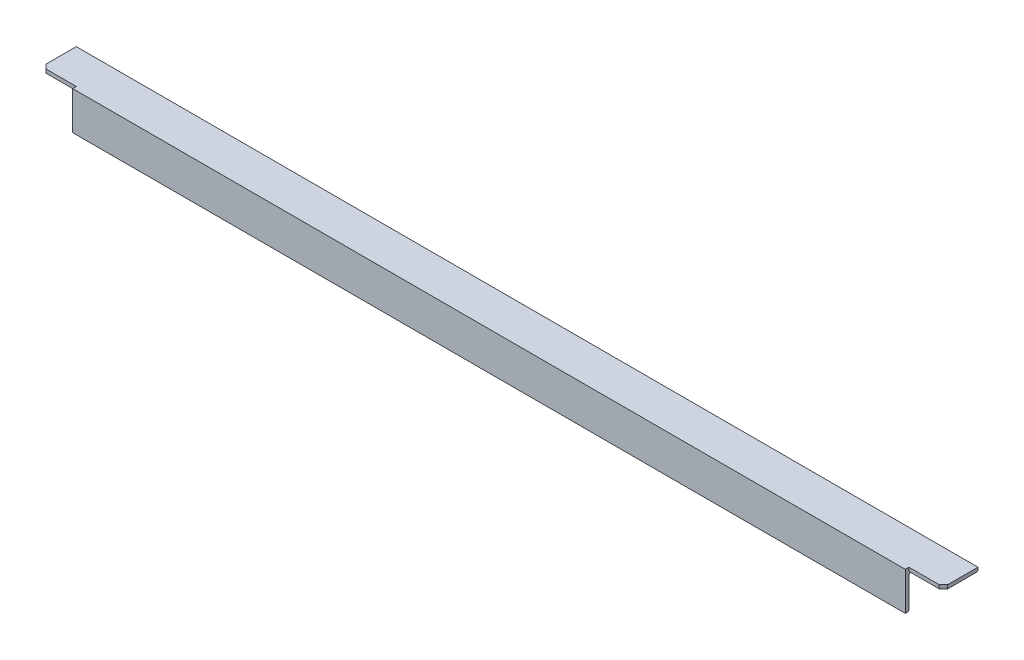
ISO-10303-21;
HEADER;
FILE_DESCRIPTION(('STEP AP214'),'2;1');
FILE_NAME('part.step','',(''),(''),'','','');
FILE_SCHEMA(('AUTOMOTIVE_DESIGN { 1 0 10303 214 1 1 1 1 }'));
ENDSEC;
DATA;
#1=APPLICATION_CONTEXT('core data for automotive mechanical design processes');
#2=APPLICATION_PROTOCOL_DEFINITION('international standard','automotive_design',2000,#1);
#3=PRODUCT_CONTEXT('',#1,'mechanical');
#4=PRODUCT('Part','Part','',(#3));
#5=PRODUCT_RELATED_PRODUCT_CATEGORY('part','',(#4));
#6=PRODUCT_DEFINITION_FORMATION('','',#4);
#7=PRODUCT_DEFINITION_CONTEXT('part definition',#1,'design');
#8=PRODUCT_DEFINITION('design','',#6,#7);
#9=PRODUCT_DEFINITION_SHAPE('','',#8);
#10=(LENGTH_UNIT() NAMED_UNIT(*) SI_UNIT(.MILLI.,.METRE.));
#11=(NAMED_UNIT(*) PLANE_ANGLE_UNIT() SI_UNIT($,.RADIAN.));
#12=(NAMED_UNIT(*) SI_UNIT($,.STERADIAN.) SOLID_ANGLE_UNIT());
#13=UNCERTAINTY_MEASURE_WITH_UNIT(LENGTH_MEASURE(1.E-05),#10,'distance_accuracy_value','');
#14=(GEOMETRIC_REPRESENTATION_CONTEXT(3) GLOBAL_UNCERTAINTY_ASSIGNED_CONTEXT((#13)) GLOBAL_UNIT_ASSIGNED_CONTEXT((#10,
#11,#12)) REPRESENTATION_CONTEXT('',''));
#15=CARTESIAN_POINT('',(0.,0.,0.));
#16=DIRECTION('',(0.,0.,1.));
#17=DIRECTION('',(1.,0.,0.));
#18=AXIS2_PLACEMENT_3D('',#15,#16,#17);
#19=CARTESIAN_POINT('',(750.,587.,487.));
#20=DIRECTION('',(-1.,0.,0.));
#21=DIRECTION('',(0.,0.,1.));
#22=AXIS2_PLACEMENT_3D('',#19,#20,#21);
#23=CYLINDRICAL_SURFACE('',#22,7.00000000000001);
#24=CARTESIAN_POINT('',(-687.,587.,487.));
#25=DIRECTION('',(-1.,0.,0.));
#26=DIRECTION('',(0.,0.,1.));
#27=AXIS2_PLACEMENT_3D('',#24,#25,#26);
#28=CIRCLE('',#27,7.00000000000001);
#29=CARTESIAN_POINT('',(-687.,594.000000000001,486.999999999988));
#30=VERTEX_POINT('',#29);
#31=CARTESIAN_POINT('',(-687.,587.,494.));
#32=VERTEX_POINT('',#31);
#33=EDGE_CURVE('E237',#30,#32,#28,.F.);
#34=ORIENTED_EDGE('',*,*,#33,.F.);
#35=DIRECTION('',(-1.,0.,0.));
#36=VECTOR('',#35,1.);
#37=CARTESIAN_POINT('',(750.,594.,487.));
#38=LINE('',#37,#36);
#39=CARTESIAN_POINT('',(687.,594.000000000001,486.999999999999));
#40=VERTEX_POINT('',#39);
#41=EDGE_CURVE('E122',#40,#30,#38,.T.);
#42=ORIENTED_EDGE('',*,*,#41,.F.);
#43=CARTESIAN_POINT('',(687.,587.,487.));
#44=DIRECTION('',(1.,0.,0.));
#45=DIRECTION('',(0.,0.,-1.));
#46=AXIS2_PLACEMENT_3D('',#43,#44,#45);
#47=CIRCLE('',#46,7.00000000000001);
#48=CARTESIAN_POINT('',(687.,587.,493.999999999999));
#49=VERTEX_POINT('',#48);
#50=EDGE_CURVE('E138',#49,#40,#47,.F.);
#51=ORIENTED_EDGE('',*,*,#50,.F.);
#52=DIRECTION('',(-1.,0.,0.));
#53=VECTOR('',#52,1.);
#54=CARTESIAN_POINT('',(750.,587.,494.));
#55=LINE('',#54,#53);
#56=EDGE_CURVE('E195',#49,#32,#55,.T.);
#57=ORIENTED_EDGE('',*,*,#56,.T.);
#58=EDGE_LOOP('',(#34,#42,#51,#57));
#59=FACE_BOUND('',#58,.T.);
#60=ADVANCED_FACE('F34',(#59),#23,.F.);
#61=CARTESIAN_POINT('',(750.,600.000000000001,437.));
#62=DIRECTION('',(0.,0.,1.));
#63=DIRECTION('',(0.,-1.,0.));
#64=AXIS2_PLACEMENT_3D('',#61,#62,#63);
#65=PLANE('',#64);
#66=DIRECTION('',(0.,-1.,0.));
#67=VECTOR('',#66,1.);
#68=CARTESIAN_POINT('',(-744.000000000001,1100.,437.));
#69=LINE('',#68,#67);
#70=CARTESIAN_POINT('',(-744.000000000001,600.000000000001,437.));
#71=VERTEX_POINT('',#70);
#72=CARTESIAN_POINT('',(-744.000000000001,596.300000000001,437.));
#73=VERTEX_POINT('',#72);
#74=EDGE_CURVE('E205',#71,#73,#69,.T.);
#75=ORIENTED_EDGE('',*,*,#74,.F.);
#76=DIRECTION('',(-1.,0.,0.));
#77=VECTOR('',#76,1.);
#78=CARTESIAN_POINT('',(750.,600.000000000001,437.));
#79=LINE('',#78,#77);
#80=CARTESIAN_POINT('',(744.,600.000000000001,437.));
#81=VERTEX_POINT('',#80);
#82=EDGE_CURVE('E131',#81,#71,#79,.T.);
#83=ORIENTED_EDGE('',*,*,#82,.F.);
#84=DIRECTION('',(0.,1.,0.));
#85=VECTOR('',#84,1.);
#86=CARTESIAN_POINT('',(744.,0.,437.));
#87=LINE('',#86,#85);
#88=CARTESIAN_POINT('',(744.,596.300000000001,437.));
#89=VERTEX_POINT('',#88);
#90=EDGE_CURVE('E179',#89,#81,#87,.T.);
#91=ORIENTED_EDGE('',*,*,#90,.F.);
#92=DIRECTION('',(-1.,0.,0.));
#93=VECTOR('',#92,1.);
#94=CARTESIAN_POINT('',(750.,596.300000000001,437.));
#95=LINE('',#94,#93);
#96=EDGE_CURVE('E135',#89,#73,#95,.T.);
#97=ORIENTED_EDGE('',*,*,#96,.T.);
#98=EDGE_LOOP('',(#75,#83,#91,#97));
#99=FACE_BOUND('',#98,.T.);
#100=ADVANCED_FACE('F36',(#99),#65,.F.);
#101=CARTESIAN_POINT('',(750.,600.000000000001,437.));
#102=DIRECTION('',(0.,-1.,0.));
#103=DIRECTION('',(0.,0.,-1.));
#104=AXIS2_PLACEMENT_3D('',#101,#102,#103);
#105=PLANE('',#104);
#106=DIRECTION('',(0.,0.,-1.));
#107=VECTOR('',#106,1.);
#108=CARTESIAN_POINT('',(-744.000000000001,600.000000000001,437.000000000013));
#109=LINE('',#108,#107);
#110=CARTESIAN_POINT('',(-744.,600.000000000001,487.));
#111=VERTEX_POINT('',#110);
#112=EDGE_CURVE('E203',#111,#71,#109,.T.);
#113=ORIENTED_EDGE('',*,*,#112,.F.);
#114=DIRECTION('',(0.707106781186548,0.,0.707106781186547));
#115=VECTOR('',#114,1.);
#116=CARTESIAN_POINT('',(-21.999999999999,599.999999999992,1209.));
#117=LINE('',#116,#115);
#118=CARTESIAN_POINT('',(-737.,600.,494.));
#119=VERTEX_POINT('',#118);
#120=EDGE_CURVE('E137',#111,#119,#117,.T.);
#121=ORIENTED_EDGE('',*,*,#120,.T.);
#122=DIRECTION('',(-1.,0.,0.));
#123=VECTOR('',#122,1.);
#124=CARTESIAN_POINT('',(750.,600.,493.999999999989));
#125=LINE('',#124,#123);
#126=CARTESIAN_POINT('',(-687.,600.,494.));
#127=VERTEX_POINT('',#126);
#128=EDGE_CURVE('E197',#127,#119,#125,.T.);
#129=ORIENTED_EDGE('',*,*,#128,.F.);
#130=DIRECTION('',(0.,0.,-1.));
#131=VECTOR('',#130,1.);
#132=CARTESIAN_POINT('',(-687.,600.000000000001,436.999999999995));
#133=LINE('',#132,#131);
#134=CARTESIAN_POINT('',(-687.,600.,500.));
#135=VERTEX_POINT('',#134);
#136=EDGE_CURVE('E74',#135,#127,#133,.T.);
#137=ORIENTED_EDGE('',*,*,#136,.F.);
#138=DIRECTION('',(-1.,0.,0.));
#139=VECTOR('',#138,1.);
#140=CARTESIAN_POINT('',(750.,600.,500.));
#141=LINE('',#140,#139);
#142=CARTESIAN_POINT('',(687.,600.,500.));
#143=VERTEX_POINT('',#142);
#144=EDGE_CURVE('E124',#143,#135,#141,.T.);
#145=ORIENTED_EDGE('',*,*,#144,.F.);
#146=DIRECTION('',(0.,0.,1.));
#147=VECTOR('',#146,1.);
#148=CARTESIAN_POINT('',(687.,600.000000000001,437.));
#149=LINE('',#148,#147);
#150=CARTESIAN_POINT('',(687.,600.,494.));
#151=VERTEX_POINT('',#150);
#152=EDGE_CURVE('E171',#151,#143,#149,.T.);
#153=ORIENTED_EDGE('',*,*,#152,.F.);
#154=DIRECTION('',(-1.,0.,0.));
#155=VECTOR('',#154,1.);
#156=CARTESIAN_POINT('',(749.999999999999,600.,494.));
#157=LINE('',#156,#155);
#158=CARTESIAN_POINT('',(737.,600.,494.));
#159=VERTEX_POINT('',#158);
#160=EDGE_CURVE('E193',#159,#151,#157,.T.);
#161=ORIENTED_EDGE('',*,*,#160,.F.);
#162=DIRECTION('',(0.707106781186548,0.,-0.707106781186547));
#163=VECTOR('',#162,1.);
#164=CARTESIAN_POINT('',(772.,600.000000000001,459.));
#165=LINE('',#164,#163);
#166=CARTESIAN_POINT('',(744.,600.000000000001,487.));
#167=VERTEX_POINT('',#166);
#168=EDGE_CURVE('E134',#159,#167,#165,.T.);
#169=ORIENTED_EDGE('',*,*,#168,.T.);
#170=DIRECTION('',(0.,0.,1.));
#171=VECTOR('',#170,1.);
#172=CARTESIAN_POINT('',(744.,600.000000000001,437.));
#173=LINE('',#172,#171);
#174=EDGE_CURVE('E170',#81,#167,#173,.T.);
#175=ORIENTED_EDGE('',*,*,#174,.F.);
#176=ORIENTED_EDGE('',*,*,#82,.T.);
#177=EDGE_LOOP('',(#113,#121,#129,#137,#145,#153,#161,#169,#175,#176));
#178=FACE_BOUND('',#177,.T.);
#179=ADVANCED_FACE('F267',(#178),#105,.F.);
#180=CARTESIAN_POINT('',(750.,600.,500.));
#181=DIRECTION('',(0.,0.,-1.));
#182=DIRECTION('',(0.,1.,0.));
#183=AXIS2_PLACEMENT_3D('',#180,#181,#182);
#184=PLANE('',#183);
#185=DIRECTION('',(0.,-1.,0.));
#186=VECTOR('',#185,1.);
#187=CARTESIAN_POINT('',(-687.,1100.,500.));
#188=LINE('',#187,#186);
#189=CARTESIAN_POINT('',(-687.,537.,500.));
#190=VERTEX_POINT('',#189);
#191=EDGE_CURVE('E58',#135,#190,#188,.T.);
#192=ORIENTED_EDGE('',*,*,#191,.T.);
#193=DIRECTION('',(-1.,0.,0.));
#194=VECTOR('',#193,1.);
#195=CARTESIAN_POINT('',(750.,537.,499.999999999999));
#196=LINE('',#195,#194);
#197=CARTESIAN_POINT('',(687.,537.,499.999999999999));
#198=VERTEX_POINT('',#197);
#199=EDGE_CURVE('E114',#198,#190,#196,.T.);
#200=ORIENTED_EDGE('',*,*,#199,.F.);
#201=DIRECTION('',(0.,1.,0.));
#202=VECTOR('',#201,1.);
#203=CARTESIAN_POINT('',(687.,0.,499.999999999999));
#204=LINE('',#203,#202);
#205=EDGE_CURVE('E130',#198,#143,#204,.T.);
#206=ORIENTED_EDGE('',*,*,#205,.T.);
#207=ORIENTED_EDGE('',*,*,#144,.T.);
#208=EDGE_LOOP('',(#192,#200,#206,#207));
#209=FACE_BOUND('',#208,.T.);
#210=ADVANCED_FACE('F272',(#209),#184,.F.);
#211=CARTESIAN_POINT('',(750.,537.,496.299999999999));
#212=DIRECTION('',(0.,1.,0.));
#213=DIRECTION('',(0.,0.,1.));
#214=AXIS2_PLACEMENT_3D('',#211,#212,#213);
#215=PLANE('',#214);
#216=DIRECTION('',(0.,0.,1.));
#217=VECTOR('',#216,1.);
#218=CARTESIAN_POINT('',(-687.,537.,496.299999999995));
#219=LINE('',#218,#217);
#220=CARTESIAN_POINT('',(-687.,537.,496.299999999999));
#221=VERTEX_POINT('',#220);
#222=EDGE_CURVE('E98',#221,#190,#219,.T.);
#223=ORIENTED_EDGE('',*,*,#222,.F.);
#224=DIRECTION('',(-1.,0.,0.));
#225=VECTOR('',#224,1.);
#226=CARTESIAN_POINT('',(750.,537.,496.299999999999));
#227=LINE('',#226,#225);
#228=CARTESIAN_POINT('',(687.,537.,496.299999999999));
#229=VERTEX_POINT('',#228);
#230=EDGE_CURVE('E112',#229,#221,#227,.T.);
#231=ORIENTED_EDGE('',*,*,#230,.F.);
#232=DIRECTION('',(0.,0.,-1.));
#233=VECTOR('',#232,1.);
#234=CARTESIAN_POINT('',(687.,537.,496.3));
#235=LINE('',#234,#233);
#236=EDGE_CURVE('E187',#198,#229,#235,.T.);
#237=ORIENTED_EDGE('',*,*,#236,.F.);
#238=ORIENTED_EDGE('',*,*,#199,.T.);
#239=EDGE_LOOP('',(#223,#231,#237,#238));
#240=FACE_BOUND('',#239,.T.);
#241=ADVANCED_FACE('F109',(#240),#215,.F.);
#242=CARTESIAN_POINT('',(750.,539.3,496.299999999999));
#243=DIRECTION('',(-1.,0.,0.));
#244=DIRECTION('',(0.,0.,1.));
#245=AXIS2_PLACEMENT_3D('',#242,#243,#244);
#246=CYLINDRICAL_SURFACE('',#245,2.29999999999997);
#247=CARTESIAN_POINT('',(-687.,539.3,496.299999999999));
#248=DIRECTION('',(-1.,0.,0.));
#249=DIRECTION('',(0.,0.,1.));
#250=AXIS2_PLACEMENT_3D('',#247,#248,#249);
#251=CIRCLE('',#250,2.29999999999997);
#252=CARTESIAN_POINT('',(-687.,539.3,494.));
#253=VERTEX_POINT('',#252);
#254=EDGE_CURVE('E95',#253,#221,#251,.T.);
#255=ORIENTED_EDGE('',*,*,#254,.F.);
#256=DIRECTION('',(-1.,0.,0.));
#257=VECTOR('',#256,1.);
#258=CARTESIAN_POINT('',(750.,539.3,493.999999999999));
#259=LINE('',#258,#257);
#260=CARTESIAN_POINT('',(687.,539.3,494.));
#261=VERTEX_POINT('',#260);
#262=EDGE_CURVE('E120',#261,#253,#259,.T.);
#263=ORIENTED_EDGE('',*,*,#262,.F.);
#264=CARTESIAN_POINT('',(687.,539.3,496.299999999999));
#265=DIRECTION('',(1.,0.,0.));
#266=DIRECTION('',(0.,0.,-1.));
#267=AXIS2_PLACEMENT_3D('',#264,#265,#266);
#268=CIRCLE('',#267,2.29999999999997);
#269=EDGE_CURVE('E119',#229,#261,#268,.T.);
#270=ORIENTED_EDGE('',*,*,#269,.F.);
#271=ORIENTED_EDGE('',*,*,#230,.T.);
#272=EDGE_LOOP('',(#255,#263,#270,#271));
#273=FACE_BOUND('',#272,.T.);
#274=ADVANCED_FACE('F117',(#273),#246,.T.);
#275=CARTESIAN_POINT('',(750.,587.,494.));
#276=DIRECTION('',(0.,0.,1.));
#277=DIRECTION('',(0.,-1.,0.));
#278=AXIS2_PLACEMENT_3D('',#275,#276,#277);
#279=PLANE('',#278);
#280=DIRECTION('',(0.,-1.,0.));
#281=VECTOR('',#280,1.);
#282=CARTESIAN_POINT('',(-687.,1100.,494.));
#283=LINE('',#282,#281);
#284=EDGE_CURVE('E100',#32,#253,#283,.T.);
#285=ORIENTED_EDGE('',*,*,#284,.F.);
#286=ORIENTED_EDGE('',*,*,#56,.F.);
#287=DIRECTION('',(0.,1.,0.));
#288=VECTOR('',#287,1.);
#289=CARTESIAN_POINT('',(687.,0.,494.));
#290=LINE('',#289,#288);
#291=EDGE_CURVE('E186',#261,#49,#290,.T.);
#292=ORIENTED_EDGE('',*,*,#291,.F.);
#293=ORIENTED_EDGE('',*,*,#262,.T.);
#294=EDGE_LOOP('',(#285,#286,#292,#293));
#295=FACE_BOUND('',#294,.T.);
#296=ADVANCED_FACE('F293',(#295),#279,.F.);
#297=CARTESIAN_POINT('',(750.,594.000000000001,439.3));
#298=DIRECTION('',(0.,1.,0.));
#299=DIRECTION('',(0.,0.,1.));
#300=AXIS2_PLACEMENT_3D('',#297,#298,#299);
#301=PLANE('',#300);
#302=DIRECTION('',(0.,0.,1.));
#303=VECTOR('',#302,1.);
#304=CARTESIAN_POINT('',(-744.000000000001,594.000000000001,439.300000000013));
#305=LINE('',#304,#303);
#306=CARTESIAN_POINT('',(-744.000000000001,594.000000000001,439.3));
#307=VERTEX_POINT('',#306);
#308=CARTESIAN_POINT('',(-744.,594.000000000001,486.999999999988));
#309=VERTEX_POINT('',#308);
#310=EDGE_CURVE('E207',#307,#309,#305,.T.);
#311=ORIENTED_EDGE('',*,*,#310,.F.);
#312=DIRECTION('',(-1.,0.,0.));
#313=VECTOR('',#312,1.);
#314=CARTESIAN_POINT('',(750.,594.000000000001,439.3));
#315=LINE('',#314,#313);
#316=CARTESIAN_POINT('',(744.,594.000000000001,439.3));
#317=VERTEX_POINT('',#316);
#318=EDGE_CURVE('E176',#317,#307,#315,.T.);
#319=ORIENTED_EDGE('',*,*,#318,.F.);
#320=DIRECTION('',(0.,0.,-1.));
#321=VECTOR('',#320,1.);
#322=CARTESIAN_POINT('',(744.,594.000000000001,439.3));
#323=LINE('',#322,#321);
#324=CARTESIAN_POINT('',(744.,594.000000000001,487.));
#325=VERTEX_POINT('',#324);
#326=EDGE_CURVE('E166',#325,#317,#323,.T.);
#327=ORIENTED_EDGE('',*,*,#326,.F.);
#328=DIRECTION('',(0.707106781186548,0.,-0.707106781186547));
#329=VECTOR('',#328,1.);
#330=CARTESIAN_POINT('',(744.,594.000000000001,487.));
#331=LINE('',#330,#329);
#332=CARTESIAN_POINT('',(737.,594.000000000001,494.));
#333=VERTEX_POINT('',#332);
#334=EDGE_CURVE('E42',#333,#325,#331,.T.);
#335=ORIENTED_EDGE('',*,*,#334,.F.);
#336=DIRECTION('',(1.,0.,0.));
#337=VECTOR('',#336,1.);
#338=CARTESIAN_POINT('',(677.100505063388,594.000000000001,493.999999999999));
#339=LINE('',#338,#337);
#340=CARTESIAN_POINT('',(687.,594.000000000001,494.));
#341=VERTEX_POINT('',#340);
#342=EDGE_CURVE('E264',#341,#333,#339,.T.);
#343=ORIENTED_EDGE('',*,*,#342,.F.);
#344=DIRECTION('',(0.,0.,-1.));
#345=VECTOR('',#344,1.);
#346=CARTESIAN_POINT('',(687.,594.000000000001,486.999999999999));
#347=LINE('',#346,#345);
#348=EDGE_CURVE('E49',#341,#40,#347,.T.);
#349=ORIENTED_EDGE('',*,*,#348,.T.);
#350=ORIENTED_EDGE('',*,*,#41,.T.);
#351=DIRECTION('',(0.,0.,1.));
#352=VECTOR('',#351,1.);
#353=CARTESIAN_POINT('',(-687.,594.000000000001,439.300000000001));
#354=LINE('',#353,#352);
#355=CARTESIAN_POINT('',(-687.,594.000000000001,493.999999999988));
#356=VERTEX_POINT('',#355);
#357=EDGE_CURVE('E228',#30,#356,#354,.T.);
#358=ORIENTED_EDGE('',*,*,#357,.T.);
#359=DIRECTION('',(-1.,0.,0.));
#360=VECTOR('',#359,1.);
#361=CARTESIAN_POINT('',(-677.100505063388,594.000000000001,493.999999999988));
#362=LINE('',#361,#360);
#363=CARTESIAN_POINT('',(-737.000000000013,594.000000000001,493.999999999987));
#364=VERTEX_POINT('',#363);
#365=EDGE_CURVE('E425',#356,#364,#362,.T.);
#366=ORIENTED_EDGE('',*,*,#365,.T.);
#367=DIRECTION('',(0.707106781186548,0.,0.707106781186547));
#368=VECTOR('',#367,1.);
#369=CARTESIAN_POINT('',(-744.,594.000000000001,487.));
#370=LINE('',#369,#368);
#371=EDGE_CURVE('E11',#309,#364,#370,.T.);
#372=ORIENTED_EDGE('',*,*,#371,.F.);
#373=EDGE_LOOP('',(#311,#319,#327,#335,#343,#349,#350,#358,#366,#372));
#374=FACE_BOUND('',#373,.T.);
#375=ADVANCED_FACE('F174',(#374),#301,.F.);
#376=CARTESIAN_POINT('',(750.,596.300000000001,439.3));
#377=DIRECTION('',(-1.,0.,0.));
#378=DIRECTION('',(0.,0.,1.));
#379=AXIS2_PLACEMENT_3D('',#376,#377,#378);
#380=CYLINDRICAL_SURFACE('',#379,2.3);
#381=CARTESIAN_POINT('',(-744.000000000001,596.300000000001,439.3));
#382=DIRECTION('',(-1.,0.,0.));
#383=DIRECTION('',(0.,0.,1.));
#384=AXIS2_PLACEMENT_3D('',#381,#382,#383);
#385=CIRCLE('',#384,2.3);
#386=EDGE_CURVE('E83',#73,#307,#385,.T.);
#387=ORIENTED_EDGE('',*,*,#386,.F.);
#388=ORIENTED_EDGE('',*,*,#96,.F.);
#389=CARTESIAN_POINT('',(744.,596.300000000001,439.3));
#390=DIRECTION('',(1.,0.,0.));
#391=DIRECTION('',(0.,0.,-1.));
#392=AXIS2_PLACEMENT_3D('',#389,#390,#391);
#393=CIRCLE('',#392,2.3);
#394=EDGE_CURVE('E177',#317,#89,#393,.T.);
#395=ORIENTED_EDGE('',*,*,#394,.F.);
#396=ORIENTED_EDGE('',*,*,#318,.T.);
#397=EDGE_LOOP('',(#387,#388,#395,#396));
#398=FACE_BOUND('',#397,.T.);
#399=ADVANCED_FACE('F285',(#398),#380,.T.);
#400=CARTESIAN_POINT('',(737.,0.,494.));
#401=DIRECTION('',(0.,0.,1.));
#402=DIRECTION('',(1.,0.,0.));
#403=AXIS2_PLACEMENT_3D('',#400,#401,#402);
#404=PLANE('',#403);
#405=ORIENTED_EDGE('',*,*,#342,.T.);
#406=DIRECTION('',(0.,1.,0.));
#407=VECTOR('',#406,1.);
#408=CARTESIAN_POINT('',(737.,0.,494.));
#409=LINE('',#408,#407);
#410=EDGE_CURVE('E153',#333,#159,#409,.T.);
#411=ORIENTED_EDGE('',*,*,#410,.T.);
#412=ORIENTED_EDGE('',*,*,#160,.T.);
#413=EDGE_CURVE('E181',#341,#151,#290,.T.);
#414=ORIENTED_EDGE('',*,*,#413,.F.);
#415=EDGE_LOOP('',(#405,#411,#412,#414));
#416=FACE_BOUND('',#415,.T.);
#417=ADVANCED_FACE('F260',(#416),#404,.T.);
#418=CARTESIAN_POINT('',(744.,0.,487.));
#419=DIRECTION('',(-0.707106781186547,0.,-0.707106781186548));
#420=DIRECTION('',(-0.707106781186548,0.,0.707106781186547));
#421=AXIS2_PLACEMENT_3D('',#418,#419,#420);
#422=PLANE('',#421);
#423=ORIENTED_EDGE('',*,*,#410,.F.);
#424=ORIENTED_EDGE('',*,*,#334,.T.);
#425=DIRECTION('',(0.,1.,0.));
#426=VECTOR('',#425,1.);
#427=CARTESIAN_POINT('',(744.,0.,487.));
#428=LINE('',#427,#426);
#429=EDGE_CURVE('E149',#325,#167,#428,.T.);
#430=ORIENTED_EDGE('',*,*,#429,.T.);
#431=ORIENTED_EDGE('',*,*,#168,.F.);
#432=EDGE_LOOP('',(#423,#424,#430,#431));
#433=FACE_BOUND('',#432,.T.);
#434=ADVANCED_FACE('F146',(#433),#422,.F.);
#435=CARTESIAN_POINT('',(687.,0.,496.299999999999));
#436=DIRECTION('',(1.,0.,0.));
#437=DIRECTION('',(0.,0.,-1.));
#438=AXIS2_PLACEMENT_3D('',#435,#436,#437);
#439=PLANE('',#438);
#440=ORIENTED_EDGE('',*,*,#152,.T.);
#441=ORIENTED_EDGE('',*,*,#205,.F.);
#442=ORIENTED_EDGE('',*,*,#236,.T.);
#443=ORIENTED_EDGE('',*,*,#269,.T.);
#444=ORIENTED_EDGE('',*,*,#291,.T.);
#445=ORIENTED_EDGE('',*,*,#50,.T.);
#446=ORIENTED_EDGE('',*,*,#348,.F.);
#447=ORIENTED_EDGE('',*,*,#413,.T.);
#448=EDGE_LOOP('',(#440,#441,#442,#443,#444,#445,#446,#447));
#449=FACE_BOUND('',#448,.T.);
#450=ADVANCED_FACE('F270',(#449),#439,.T.);
#451=CARTESIAN_POINT('',(744.,0.,439.3));
#452=DIRECTION('',(1.,0.,0.));
#453=DIRECTION('',(0.,0.,-1.));
#454=AXIS2_PLACEMENT_3D('',#451,#452,#453);
#455=PLANE('',#454);
#456=ORIENTED_EDGE('',*,*,#174,.T.);
#457=ORIENTED_EDGE('',*,*,#429,.F.);
#458=ORIENTED_EDGE('',*,*,#326,.T.);
#459=ORIENTED_EDGE('',*,*,#394,.T.);
#460=ORIENTED_EDGE('',*,*,#90,.T.);
#461=EDGE_LOOP('',(#456,#457,#458,#459,#460));
#462=FACE_BOUND('',#461,.T.);
#463=ADVANCED_FACE('F163',(#462),#455,.T.);
#464=CARTESIAN_POINT('',(-737.,1100.,494.));
#465=DIRECTION('',(0.,0.,1.));
#466=DIRECTION('',(1.,0.,0.));
#467=AXIS2_PLACEMENT_3D('',#464,#465,#466);
#468=PLANE('',#467);
#469=ORIENTED_EDGE('',*,*,#365,.F.);
#470=EDGE_CURVE('E210',#127,#356,#283,.T.);
#471=ORIENTED_EDGE('',*,*,#470,.F.);
#472=ORIENTED_EDGE('',*,*,#128,.T.);
#473=DIRECTION('',(0.,-1.,0.));
#474=VECTOR('',#473,1.);
#475=CARTESIAN_POINT('',(-737.,1100.,494.));
#476=LINE('',#475,#474);
#477=EDGE_CURVE('E200',#119,#364,#476,.T.);
#478=ORIENTED_EDGE('',*,*,#477,.T.);
#479=EDGE_LOOP('',(#469,#471,#472,#478));
#480=FACE_BOUND('',#479,.T.);
#481=ADVANCED_FACE('F382',(#480),#468,.T.);
#482=CARTESIAN_POINT('',(-744.,1100.,487.));
#483=DIRECTION('',(0.707106781186547,0.,-0.707106781186548));
#484=DIRECTION('',(-0.707106781186548,0.,-0.707106781186547));
#485=AXIS2_PLACEMENT_3D('',#482,#483,#484);
#486=PLANE('',#485);
#487=DIRECTION('',(0.,-1.,0.));
#488=VECTOR('',#487,1.);
#489=CARTESIAN_POINT('',(-744.,1100.,487.));
#490=LINE('',#489,#488);
#491=EDGE_CURVE('E206',#111,#309,#490,.T.);
#492=ORIENTED_EDGE('',*,*,#491,.T.);
#493=ORIENTED_EDGE('',*,*,#371,.T.);
#494=ORIENTED_EDGE('',*,*,#477,.F.);
#495=ORIENTED_EDGE('',*,*,#120,.F.);
#496=EDGE_LOOP('',(#492,#493,#494,#495));
#497=FACE_BOUND('',#496,.T.);
#498=ADVANCED_FACE('F391',(#497),#486,.F.);
#499=CARTESIAN_POINT('',(-744.000000000001,1100.,439.3));
#500=DIRECTION('',(-1.,0.,0.));
#501=DIRECTION('',(0.,0.,1.));
#502=AXIS2_PLACEMENT_3D('',#499,#500,#501);
#503=PLANE('',#502);
#504=ORIENTED_EDGE('',*,*,#112,.T.);
#505=ORIENTED_EDGE('',*,*,#74,.T.);
#506=ORIENTED_EDGE('',*,*,#386,.T.);
#507=ORIENTED_EDGE('',*,*,#310,.T.);
#508=ORIENTED_EDGE('',*,*,#491,.F.);
#509=EDGE_LOOP('',(#504,#505,#506,#507,#508));
#510=FACE_BOUND('',#509,.T.);
#511=ADVANCED_FACE('F282',(#510),#503,.T.);
#512=CARTESIAN_POINT('',(-687.,1100.,496.3));
#513=DIRECTION('',(-1.,0.,0.));
#514=DIRECTION('',(0.,0.,1.));
#515=AXIS2_PLACEMENT_3D('',#512,#513,#514);
#516=PLANE('',#515);
#517=ORIENTED_EDGE('',*,*,#136,.T.);
#518=ORIENTED_EDGE('',*,*,#470,.T.);
#519=ORIENTED_EDGE('',*,*,#357,.F.);
#520=ORIENTED_EDGE('',*,*,#33,.T.);
#521=ORIENTED_EDGE('',*,*,#284,.T.);
#522=ORIENTED_EDGE('',*,*,#254,.T.);
#523=ORIENTED_EDGE('',*,*,#222,.T.);
#524=ORIENTED_EDGE('',*,*,#191,.F.);
#525=EDGE_LOOP('',(#517,#518,#519,#520,#521,#522,#523,#524));
#526=FACE_BOUND('',#525,.T.);
#527=ADVANCED_FACE('F97',(#526),#516,.T.);
#528=CLOSED_SHELL('',(#60,#100,#179,#210,#241,#274,#296,#375,#399,#417,#434,#450,#463,#481,#498,
#511,#527));
#529=MANIFOLD_SOLID_BREP('B2',#528);
#530=ADVANCED_BREP_SHAPE_REPRESENTATION('',(#18,#529),#14);
#531=SHAPE_DEFINITION_REPRESENTATION(#9,#530);
ENDSEC;
END-ISO-10303-21;
